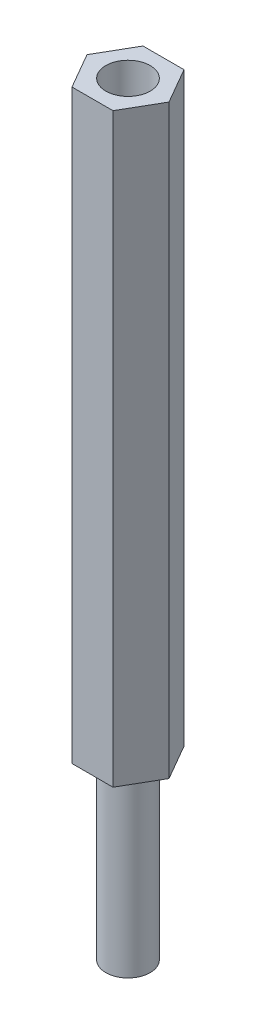
ISO-10303-21;
HEADER;
FILE_DESCRIPTION(('STEP AP214'),'2;1');
FILE_NAME('part.step','',(''),(''),'','','');
FILE_SCHEMA(('AUTOMOTIVE_DESIGN { 1 0 10303 214 1 1 1 1 }'));
ENDSEC;
DATA;
#1=APPLICATION_CONTEXT('core data for automotive mechanical design processes');
#2=APPLICATION_PROTOCOL_DEFINITION('international standard','automotive_design',2000,#1);
#3=PRODUCT_CONTEXT('',#1,'mechanical');
#4=PRODUCT('Part','Part','',(#3));
#5=PRODUCT_RELATED_PRODUCT_CATEGORY('part','',(#4));
#6=PRODUCT_DEFINITION_FORMATION('','',#4);
#7=PRODUCT_DEFINITION_CONTEXT('part definition',#1,'design');
#8=PRODUCT_DEFINITION('design','',#6,#7);
#9=PRODUCT_DEFINITION_SHAPE('','',#8);
#10=(LENGTH_UNIT() NAMED_UNIT(*) SI_UNIT(.MILLI.,.METRE.));
#11=(NAMED_UNIT(*) PLANE_ANGLE_UNIT() SI_UNIT($,.RADIAN.));
#12=(NAMED_UNIT(*) SI_UNIT($,.STERADIAN.) SOLID_ANGLE_UNIT());
#13=UNCERTAINTY_MEASURE_WITH_UNIT(LENGTH_MEASURE(1.E-05),#10,'distance_accuracy_value','');
#14=(GEOMETRIC_REPRESENTATION_CONTEXT(3) GLOBAL_UNCERTAINTY_ASSIGNED_CONTEXT((#13)) GLOBAL_UNIT_ASSIGNED_CONTEXT((#10,
#11,#12)) REPRESENTATION_CONTEXT('',''));
#15=CARTESIAN_POINT('',(0.,0.,0.));
#16=DIRECTION('',(0.,0.,1.));
#17=DIRECTION('',(1.,0.,0.));
#18=AXIS2_PLACEMENT_3D('',#15,#16,#17);
#19=CARTESIAN_POINT('',(-1.15470053837925,33.,2.));
#20=DIRECTION('',(0.,0.,-1.));
#21=DIRECTION('',(-1.,0.,0.));
#22=AXIS2_PLACEMENT_3D('',#19,#20,#21);
#23=PLANE('',#22);
#24=DIRECTION('',(1.,0.,0.));
#25=VECTOR('',#24,1.);
#26=CARTESIAN_POINT('',(-1.15470053837925,0.,2.));
#27=LINE('',#26,#25);
#28=CARTESIAN_POINT('',(-1.15470053837925,0.,2.));
#29=VERTEX_POINT('',#28);
#30=CARTESIAN_POINT('',(1.15470053837925,0.,2.));
#31=VERTEX_POINT('',#30);
#32=EDGE_CURVE('E116',#29,#31,#27,.T.);
#33=ORIENTED_EDGE('',*,*,#32,.T.);
#34=DIRECTION('',(0.,-1.,0.));
#35=VECTOR('',#34,1.);
#36=CARTESIAN_POINT('',(1.15470053837925,33.,2.));
#37=LINE('',#36,#35);
#38=CARTESIAN_POINT('',(1.15470053837925,33.,2.));
#39=VERTEX_POINT('',#38);
#40=EDGE_CURVE('E11',#39,#31,#37,.T.);
#41=ORIENTED_EDGE('',*,*,#40,.F.);
#42=DIRECTION('',(1.,0.,0.));
#43=VECTOR('',#42,1.);
#44=CARTESIAN_POINT('',(-1.15470053837925,33.,2.));
#45=LINE('',#44,#43);
#46=CARTESIAN_POINT('',(-1.15470053837925,33.,2.));
#47=VERTEX_POINT('',#46);
#48=EDGE_CURVE('E127',#47,#39,#45,.T.);
#49=ORIENTED_EDGE('',*,*,#48,.F.);
#50=DIRECTION('',(0.,-1.,0.));
#51=VECTOR('',#50,1.);
#52=CARTESIAN_POINT('',(-1.15470053837925,33.,2.));
#53=LINE('',#52,#51);
#54=EDGE_CURVE('E112',#47,#29,#53,.T.);
#55=ORIENTED_EDGE('',*,*,#54,.T.);
#56=EDGE_LOOP('',(#33,#41,#49,#55));
#57=FACE_BOUND('',#56,.T.);
#58=ADVANCED_FACE('F32',(#57),#23,.F.);
#59=CARTESIAN_POINT('',(1.15470053837925,33.,2.));
#60=DIRECTION('',(-0.866025403784439,0.,-0.5));
#61=DIRECTION('',(-0.5,0.,0.866025403784439));
#62=AXIS2_PLACEMENT_3D('',#59,#60,#61);
#63=PLANE('',#62);
#64=DIRECTION('',(0.5,0.,-0.866025403784439));
#65=VECTOR('',#64,1.);
#66=CARTESIAN_POINT('',(1.15470053837925,0.,2.));
#67=LINE('',#66,#65);
#68=CARTESIAN_POINT('',(2.3094010767585,0.,0.));
#69=VERTEX_POINT('',#68);
#70=EDGE_CURVE('E119',#31,#69,#67,.T.);
#71=ORIENTED_EDGE('',*,*,#70,.T.);
#72=DIRECTION('',(0.,-1.,0.));
#73=VECTOR('',#72,1.);
#74=CARTESIAN_POINT('',(2.3094010767585,33.,0.));
#75=LINE('',#74,#73);
#76=CARTESIAN_POINT('',(2.3094010767585,33.,0.));
#77=VERTEX_POINT('',#76);
#78=EDGE_CURVE('E40',#77,#69,#75,.T.);
#79=ORIENTED_EDGE('',*,*,#78,.F.);
#80=DIRECTION('',(0.5,0.,-0.866025403784439));
#81=VECTOR('',#80,1.);
#82=CARTESIAN_POINT('',(1.15470053837925,33.,2.));
#83=LINE('',#82,#81);
#84=EDGE_CURVE('E85',#39,#77,#83,.T.);
#85=ORIENTED_EDGE('',*,*,#84,.F.);
#86=ORIENTED_EDGE('',*,*,#40,.T.);
#87=EDGE_LOOP('',(#71,#79,#85,#86));
#88=FACE_BOUND('',#87,.T.);
#89=ADVANCED_FACE('F152',(#88),#63,.F.);
#90=CARTESIAN_POINT('',(2.3094010767585,33.,0.));
#91=DIRECTION('',(-0.866025403784439,0.,0.5));
#92=DIRECTION('',(0.5,0.,0.866025403784439));
#93=AXIS2_PLACEMENT_3D('',#90,#91,#92);
#94=PLANE('',#93);
#95=DIRECTION('',(-0.5,0.,-0.866025403784439));
#96=VECTOR('',#95,1.);
#97=CARTESIAN_POINT('',(2.3094010767585,0.,0.));
#98=LINE('',#97,#96);
#99=CARTESIAN_POINT('',(1.15470053837925,0.,-2.));
#100=VERTEX_POINT('',#99);
#101=EDGE_CURVE('E122',#69,#100,#98,.T.);
#102=ORIENTED_EDGE('',*,*,#101,.T.);
#103=DIRECTION('',(0.,-1.,0.));
#104=VECTOR('',#103,1.);
#105=CARTESIAN_POINT('',(1.15470053837925,33.,-2.));
#106=LINE('',#105,#104);
#107=CARTESIAN_POINT('',(1.15470053837925,33.,-2.));
#108=VERTEX_POINT('',#107);
#109=EDGE_CURVE('E107',#108,#100,#106,.T.);
#110=ORIENTED_EDGE('',*,*,#109,.F.);
#111=DIRECTION('',(-0.5,0.,-0.866025403784439));
#112=VECTOR('',#111,1.);
#113=CARTESIAN_POINT('',(2.3094010767585,33.,0.));
#114=LINE('',#113,#112);
#115=EDGE_CURVE('E98',#77,#108,#114,.T.);
#116=ORIENTED_EDGE('',*,*,#115,.F.);
#117=ORIENTED_EDGE('',*,*,#78,.T.);
#118=EDGE_LOOP('',(#102,#110,#116,#117));
#119=FACE_BOUND('',#118,.T.);
#120=ADVANCED_FACE('F133',(#119),#94,.F.);
#121=CARTESIAN_POINT('',(1.15470053837925,33.,-2.));
#122=DIRECTION('',(0.,0.,1.));
#123=DIRECTION('',(1.,0.,0.));
#124=AXIS2_PLACEMENT_3D('',#121,#122,#123);
#125=PLANE('',#124);
#126=DIRECTION('',(-1.,0.,0.));
#127=VECTOR('',#126,1.);
#128=CARTESIAN_POINT('',(1.15470053837925,0.,-2.));
#129=LINE('',#128,#127);
#130=CARTESIAN_POINT('',(-1.15470053837925,0.,-2.));
#131=VERTEX_POINT('',#130);
#132=EDGE_CURVE('E106',#100,#131,#129,.T.);
#133=ORIENTED_EDGE('',*,*,#132,.T.);
#134=DIRECTION('',(0.,-1.,0.));
#135=VECTOR('',#134,1.);
#136=CARTESIAN_POINT('',(-1.15470053837925,33.,-2.));
#137=LINE('',#136,#135);
#138=CARTESIAN_POINT('',(-1.15470053837925,33.,-2.));
#139=VERTEX_POINT('',#138);
#140=EDGE_CURVE('E103',#139,#131,#137,.T.);
#141=ORIENTED_EDGE('',*,*,#140,.F.);
#142=DIRECTION('',(-1.,0.,0.));
#143=VECTOR('',#142,1.);
#144=CARTESIAN_POINT('',(1.15470053837925,33.,-2.));
#145=LINE('',#144,#143);
#146=EDGE_CURVE('E92',#108,#139,#145,.T.);
#147=ORIENTED_EDGE('',*,*,#146,.F.);
#148=ORIENTED_EDGE('',*,*,#109,.T.);
#149=EDGE_LOOP('',(#133,#141,#147,#148));
#150=FACE_BOUND('',#149,.T.);
#151=ADVANCED_FACE('F104',(#150),#125,.F.);
#152=CARTESIAN_POINT('',(-1.15470053837925,33.,-2.));
#153=DIRECTION('',(0.866025403784438,0.,0.5));
#154=DIRECTION('',(0.5,0.,-0.866025403784439));
#155=AXIS2_PLACEMENT_3D('',#152,#153,#154);
#156=PLANE('',#155);
#157=DIRECTION('',(-0.5,0.,0.866025403784439));
#158=VECTOR('',#157,1.);
#159=CARTESIAN_POINT('',(-1.15470053837925,0.,-2.));
#160=LINE('',#159,#158);
#161=CARTESIAN_POINT('',(-2.3094010767585,0.,0.));
#162=VERTEX_POINT('',#161);
#163=EDGE_CURVE('E71',#131,#162,#160,.T.);
#164=ORIENTED_EDGE('',*,*,#163,.T.);
#165=DIRECTION('',(0.,-1.,0.));
#166=VECTOR('',#165,1.);
#167=CARTESIAN_POINT('',(-2.3094010767585,33.,0.));
#168=LINE('',#167,#166);
#169=CARTESIAN_POINT('',(-2.3094010767585,33.,0.));
#170=VERTEX_POINT('',#169);
#171=EDGE_CURVE('E108',#170,#162,#168,.T.);
#172=ORIENTED_EDGE('',*,*,#171,.F.);
#173=DIRECTION('',(-0.5,0.,0.866025403784439));
#174=VECTOR('',#173,1.);
#175=CARTESIAN_POINT('',(-1.15470053837925,33.,-2.));
#176=LINE('',#175,#174);
#177=EDGE_CURVE('E96',#139,#170,#176,.T.);
#178=ORIENTED_EDGE('',*,*,#177,.F.);
#179=ORIENTED_EDGE('',*,*,#140,.T.);
#180=EDGE_LOOP('',(#164,#172,#178,#179));
#181=FACE_BOUND('',#180,.T.);
#182=ADVANCED_FACE('F110',(#181),#156,.F.);
#183=CARTESIAN_POINT('',(-2.3094010767585,33.,0.));
#184=DIRECTION('',(0.866025403784439,0.,-0.5));
#185=DIRECTION('',(-0.5,0.,-0.866025403784439));
#186=AXIS2_PLACEMENT_3D('',#183,#184,#185);
#187=PLANE('',#186);
#188=DIRECTION('',(0.5,0.,0.866025403784439));
#189=VECTOR('',#188,1.);
#190=CARTESIAN_POINT('',(-2.3094010767585,0.,0.));
#191=LINE('',#190,#189);
#192=EDGE_CURVE('E77',#162,#29,#191,.T.);
#193=ORIENTED_EDGE('',*,*,#192,.T.);
#194=ORIENTED_EDGE('',*,*,#54,.F.);
#195=DIRECTION('',(0.5,0.,0.866025403784439));
#196=VECTOR('',#195,1.);
#197=CARTESIAN_POINT('',(-2.3094010767585,33.,0.));
#198=LINE('',#197,#196);
#199=EDGE_CURVE('E48',#170,#47,#198,.T.);
#200=ORIENTED_EDGE('',*,*,#199,.F.);
#201=ORIENTED_EDGE('',*,*,#171,.T.);
#202=EDGE_LOOP('',(#193,#194,#200,#201));
#203=FACE_BOUND('',#202,.T.);
#204=ADVANCED_FACE('F140',(#203),#187,.F.);
#205=CARTESIAN_POINT('',(0.,33.,0.));
#206=DIRECTION('',(0.,1.,0.));
#207=DIRECTION('',(0.,0.,1.));
#208=AXIS2_PLACEMENT_3D('',#205,#206,#207);
#209=PLANE('',#208);
#210=CARTESIAN_POINT('',(0.,33.,0.));
#211=DIRECTION('',(0.,1.,0.));
#212=DIRECTION('',(0.,0.,1.));
#213=AXIS2_PLACEMENT_3D('',#210,#211,#212);
#214=CIRCLE('',#213,1.25);
#215=CARTESIAN_POINT('',(0.,33.,1.25));
#216=VERTEX_POINT('',#215);
#217=EDGE_CURVE('E236',#216,#216,#214,.T.);
#218=ORIENTED_EDGE('',*,*,#217,.F.);
#219=EDGE_LOOP('',(#218));
#220=FACE_BOUND('',#219,.T.);
#221=ORIENTED_EDGE('',*,*,#48,.T.);
#222=ORIENTED_EDGE('',*,*,#84,.T.);
#223=ORIENTED_EDGE('',*,*,#115,.T.);
#224=ORIENTED_EDGE('',*,*,#146,.T.);
#225=ORIENTED_EDGE('',*,*,#177,.T.);
#226=ORIENTED_EDGE('',*,*,#199,.T.);
#227=EDGE_LOOP('',(#221,#222,#223,#224,#225,#226));
#228=FACE_BOUND('',#227,.T.);
#229=ADVANCED_FACE('F94',(#220,#228),#209,.T.);
#230=CARTESIAN_POINT('',(0.,0.,0.));
#231=DIRECTION('',(0.,1.,0.));
#232=DIRECTION('',(0.,0.,1.));
#233=AXIS2_PLACEMENT_3D('',#230,#231,#232);
#234=PLANE('',#233);
#235=CARTESIAN_POINT('',(0.,0.,0.));
#236=DIRECTION('',(0.,1.,0.));
#237=DIRECTION('',(0.,0.,1.));
#238=AXIS2_PLACEMENT_3D('',#235,#236,#237);
#239=CIRCLE('',#238,1.25);
#240=CARTESIAN_POINT('',(0.,0.,1.25));
#241=VERTEX_POINT('',#240);
#242=EDGE_CURVE('E235',#241,#241,#239,.T.);
#243=ORIENTED_EDGE('',*,*,#242,.T.);
#244=EDGE_LOOP('',(#243));
#245=FACE_BOUND('',#244,.T.);
#246=ORIENTED_EDGE('',*,*,#32,.F.);
#247=ORIENTED_EDGE('',*,*,#192,.F.);
#248=ORIENTED_EDGE('',*,*,#163,.F.);
#249=ORIENTED_EDGE('',*,*,#132,.F.);
#250=ORIENTED_EDGE('',*,*,#101,.F.);
#251=ORIENTED_EDGE('',*,*,#70,.F.);
#252=EDGE_LOOP('',(#246,#247,#248,#249,#250,#251));
#253=FACE_BOUND('',#252,.T.);
#254=ADVANCED_FACE('F136',(#245,#253),#234,.F.);
#255=CARTESIAN_POINT('',(0.,-10.,0.));
#256=DIRECTION('',(0.,1.,0.));
#257=DIRECTION('',(0.,0.,1.));
#258=AXIS2_PLACEMENT_3D('',#255,#256,#257);
#259=CYLINDRICAL_SURFACE('',#258,1.25);
#260=CARTESIAN_POINT('',(0.,-10.,0.));
#261=DIRECTION('',(0.,1.,0.));
#262=DIRECTION('',(0.,0.,1.));
#263=AXIS2_PLACEMENT_3D('',#260,#261,#262);
#264=CIRCLE('',#263,1.25);
#265=CARTESIAN_POINT('',(0.,-10.,1.25));
#266=VERTEX_POINT('',#265);
#267=EDGE_CURVE('E120',#266,#266,#264,.T.);
#268=ORIENTED_EDGE('',*,*,#267,.T.);
#269=EDGE_LOOP('',(#268));
#270=FACE_BOUND('',#269,.T.);
#271=ORIENTED_EDGE('',*,*,#242,.F.);
#272=EDGE_LOOP('',(#271));
#273=FACE_BOUND('',#272,.T.);
#274=ADVANCED_FACE('F184',(#270,#273),#259,.T.);
#275=CARTESIAN_POINT('',(0.,-10.,0.));
#276=DIRECTION('',(0.,1.,0.));
#277=DIRECTION('',(0.,0.,1.));
#278=AXIS2_PLACEMENT_3D('',#275,#276,#277);
#279=PLANE('',#278);
#280=ORIENTED_EDGE('',*,*,#267,.F.);
#281=EDGE_LOOP('',(#280));
#282=FACE_BOUND('',#281,.T.);
#283=ADVANCED_FACE('F193',(#282),#279,.F.);
#284=CARTESIAN_POINT('',(0.,23.,0.));
#285=DIRECTION('',(0.,1.,0.));
#286=DIRECTION('',(0.,0.,1.));
#287=AXIS2_PLACEMENT_3D('',#284,#285,#286);
#288=CYLINDRICAL_SURFACE('',#287,1.25);
#289=CARTESIAN_POINT('',(0.,23.,0.));
#290=DIRECTION('',(0.,1.,0.));
#291=DIRECTION('',(0.,0.,1.));
#292=AXIS2_PLACEMENT_3D('',#289,#290,#291);
#293=CIRCLE('',#292,1.25);
#294=CARTESIAN_POINT('',(0.,23.,1.25));
#295=VERTEX_POINT('',#294);
#296=EDGE_CURVE('E234',#295,#295,#293,.T.);
#297=ORIENTED_EDGE('',*,*,#296,.F.);
#298=EDGE_LOOP('',(#297));
#299=FACE_BOUND('',#298,.T.);
#300=ORIENTED_EDGE('',*,*,#217,.T.);
#301=EDGE_LOOP('',(#300));
#302=FACE_BOUND('',#301,.T.);
#303=ADVANCED_FACE('F203',(#299,#302),#288,.F.);
#304=CARTESIAN_POINT('',(0.,23.,0.));
#305=DIRECTION('',(0.,1.,0.));
#306=DIRECTION('',(0.,0.,1.));
#307=AXIS2_PLACEMENT_3D('',#304,#305,#306);
#308=PLANE('',#307);
#309=ORIENTED_EDGE('',*,*,#296,.T.);
#310=EDGE_LOOP('',(#309));
#311=FACE_BOUND('',#310,.T.);
#312=ADVANCED_FACE('F218',(#311),#308,.T.);
#313=CLOSED_SHELL('',(#58,#89,#120,#151,#182,#204,#229,#254,#274,#283,#303,#312));
#314=MANIFOLD_SOLID_BREP('B2',#313);
#315=ADVANCED_BREP_SHAPE_REPRESENTATION('',(#18,#314),#14);
#316=SHAPE_DEFINITION_REPRESENTATION(#9,#315);
ENDSEC;
END-ISO-10303-21;
